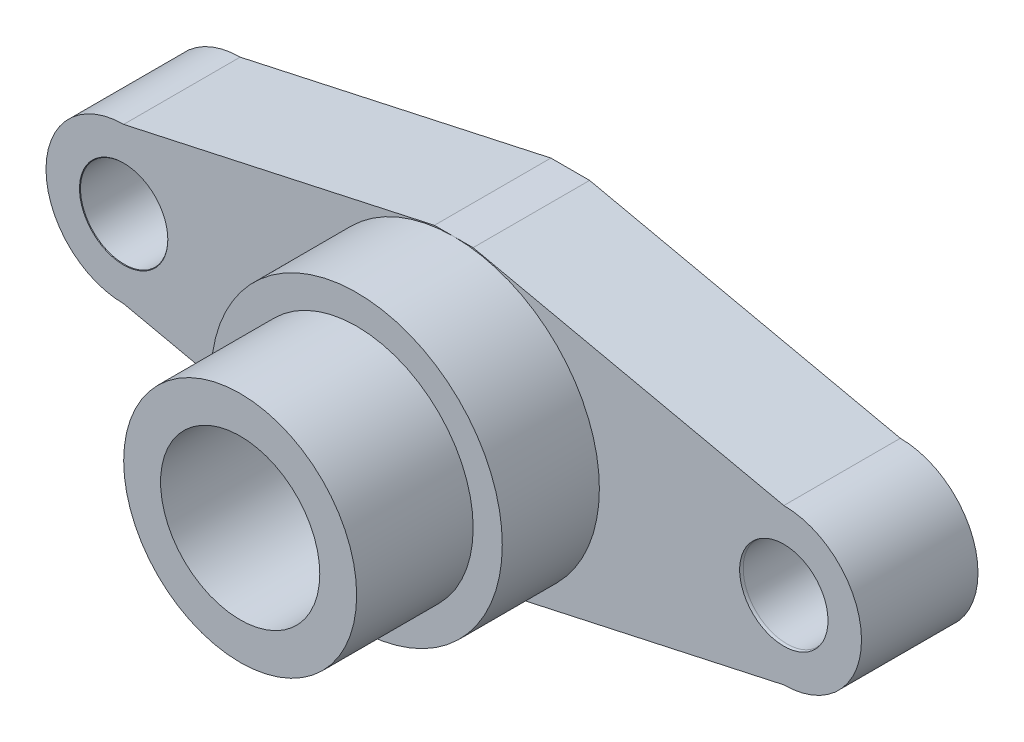
ISO-10303-21;
HEADER;
FILE_DESCRIPTION(('STEP AP214'),'2;1');
FILE_NAME('part.step','',(''),(''),'','','');
FILE_SCHEMA(('AUTOMOTIVE_DESIGN { 1 0 10303 214 1 1 1 1 }'));
ENDSEC;
DATA;
#1=APPLICATION_CONTEXT('core data for automotive mechanical design processes');
#2=APPLICATION_PROTOCOL_DEFINITION('international standard','automotive_design',2000,#1);
#3=PRODUCT_CONTEXT('',#1,'mechanical');
#4=PRODUCT('Part','Part','',(#3));
#5=PRODUCT_RELATED_PRODUCT_CATEGORY('part','',(#4));
#6=PRODUCT_DEFINITION_FORMATION('','',#4);
#7=PRODUCT_DEFINITION_CONTEXT('part definition',#1,'design');
#8=PRODUCT_DEFINITION('design','',#6,#7);
#9=PRODUCT_DEFINITION_SHAPE('','',#8);
#10=(LENGTH_UNIT() NAMED_UNIT(*) SI_UNIT(.MILLI.,.METRE.));
#11=(NAMED_UNIT(*) PLANE_ANGLE_UNIT() SI_UNIT($,.RADIAN.));
#12=(NAMED_UNIT(*) SI_UNIT($,.STERADIAN.) SOLID_ANGLE_UNIT());
#13=UNCERTAINTY_MEASURE_WITH_UNIT(LENGTH_MEASURE(1.E-05),#10,'distance_accuracy_value','');
#14=(GEOMETRIC_REPRESENTATION_CONTEXT(3) GLOBAL_UNCERTAINTY_ASSIGNED_CONTEXT((#13)) GLOBAL_UNIT_ASSIGNED_CONTEXT((#10,
#11,#12)) REPRESENTATION_CONTEXT('',''));
#15=CARTESIAN_POINT('',(0.,0.,0.));
#16=DIRECTION('',(0.,0.,1.));
#17=DIRECTION('',(1.,0.,0.));
#18=AXIS2_PLACEMENT_3D('',#15,#16,#17);
#19=CARTESIAN_POINT('',(17.,0.,6.));
#20=DIRECTION('',(0.,0.,1.));
#21=DIRECTION('',(1.,0.,0.));
#22=AXIS2_PLACEMENT_3D('',#19,#20,#21);
#23=PLANE('',#22);
#24=CARTESIAN_POINT('',(-17.,0.,6.));
#25=DIRECTION('',(0.,0.,1.));
#26=DIRECTION('',(1.,0.,0.));
#27=AXIS2_PLACEMENT_3D('',#24,#25,#26);
#28=CIRCLE('',#27,2.275);
#29=CARTESIAN_POINT('',(-14.725,0.,6.));
#30=VERTEX_POINT('',#29);
#31=EDGE_CURVE('E250',#30,#30,#28,.T.);
#32=ORIENTED_EDGE('',*,*,#31,.F.);
#33=EDGE_LOOP('',(#32));
#34=FACE_BOUND('',#33,.T.);
#35=CARTESIAN_POINT('',(0.,0.,6.));
#36=DIRECTION('',(0.,0.,1.));
#37=DIRECTION('',(1.,0.,0.));
#38=AXIS2_PLACEMENT_3D('',#35,#36,#37);
#39=CIRCLE('',#38,7.5);
#40=CARTESIAN_POINT('',(0.,7.5,6.));
#41=VERTEX_POINT('',#40);
#42=CARTESIAN_POINT('',(0.,-7.5,6.));
#43=VERTEX_POINT('',#42);
#44=EDGE_CURVE('E160',#41,#43,#39,.T.);
#45=ORIENTED_EDGE('',*,*,#44,.F.);
#46=DIRECTION('',(-1.,0.,0.));
#47=VECTOR('',#46,1.);
#48=CARTESIAN_POINT('',(-0.9965652031175,7.5,6.));
#49=LINE('',#48,#47);
#50=CARTESIAN_POINT('',(-0.9965652031175,7.5,6.));
#51=VERTEX_POINT('',#50);
#52=EDGE_CURVE('E130',#41,#51,#49,.T.);
#53=ORIENTED_EDGE('',*,*,#52,.T.);
#54=DIRECTION('',(-0.976909591411327,-0.213653107182072,0.));
#55=VECTOR('',#54,1.);
#56=CARTESIAN_POINT('',(-17.,4.,6.));
#57=LINE('',#56,#55);
#58=CARTESIAN_POINT('',(-17.,4.,6.));
#59=VERTEX_POINT('',#58);
#60=EDGE_CURVE('E123',#51,#59,#57,.T.);
#61=ORIENTED_EDGE('',*,*,#60,.T.);
#62=CARTESIAN_POINT('',(-17.,0.,6.));
#63=DIRECTION('',(0.,0.,1.));
#64=DIRECTION('',(-1.,0.,0.));
#65=AXIS2_PLACEMENT_3D('',#62,#63,#64);
#66=CIRCLE('',#65,4.);
#67=CARTESIAN_POINT('',(-17.,-4.,6.));
#68=VERTEX_POINT('',#67);
#69=EDGE_CURVE('E127',#59,#68,#66,.T.);
#70=ORIENTED_EDGE('',*,*,#69,.T.);
#71=DIRECTION('',(0.976909591411327,-0.213653107182072,0.));
#72=VECTOR('',#71,1.);
#73=CARTESIAN_POINT('',(-17.,-4.,6.));
#74=LINE('',#73,#72);
#75=CARTESIAN_POINT('',(-0.9965652031175,-7.5,6.));
#76=VERTEX_POINT('',#75);
#77=EDGE_CURVE('E70',#68,#76,#74,.T.);
#78=ORIENTED_EDGE('',*,*,#77,.T.);
#79=DIRECTION('',(1.,0.,0.));
#80=VECTOR('',#79,1.);
#81=CARTESIAN_POINT('',(-0.9965652031175,-7.5,6.));
#82=LINE('',#81,#80);
#83=EDGE_CURVE('E216',#76,#43,#82,.T.);
#84=ORIENTED_EDGE('',*,*,#83,.T.);
#85=EDGE_LOOP('',(#45,#53,#61,#70,#78,#84));
#86=FACE_BOUND('',#85,.T.);
#87=ADVANCED_FACE('F45',(#34,#86),#23,.T.);
#88=CARTESIAN_POINT('',(-0.9965652031175,-7.5,6.));
#89=DIRECTION('',(0.,1.,0.));
#90=DIRECTION('',(0.,0.,1.));
#91=AXIS2_PLACEMENT_3D('',#88,#89,#90);
#92=PLANE('',#91);
#93=DIRECTION('',(1.,0.,0.));
#94=VECTOR('',#93,1.);
#95=CARTESIAN_POINT('',(-0.9965652031175,-7.5,0.));
#96=LINE('',#95,#94);
#97=CARTESIAN_POINT('',(-0.9965652031175,-7.5,0.));
#98=VERTEX_POINT('',#97);
#99=CARTESIAN_POINT('',(0.9965652031175,-7.5,0.));
#100=VERTEX_POINT('',#99);
#101=EDGE_CURVE('E156',#98,#100,#96,.T.);
#102=ORIENTED_EDGE('',*,*,#101,.T.);
#103=DIRECTION('',(0.,0.,-1.));
#104=VECTOR('',#103,1.);
#105=CARTESIAN_POINT('',(0.9965652031175,-7.5,6.));
#106=LINE('',#105,#104);
#107=CARTESIAN_POINT('',(0.9965652031175,-7.5,6.));
#108=VERTEX_POINT('',#107);
#109=EDGE_CURVE('E196',#108,#100,#106,.T.);
#110=ORIENTED_EDGE('',*,*,#109,.F.);
#111=EDGE_CURVE('E108',#43,#108,#82,.T.);
#112=ORIENTED_EDGE('',*,*,#111,.F.);
#113=ORIENTED_EDGE('',*,*,#83,.F.);
#114=DIRECTION('',(0.,0.,-1.));
#115=VECTOR('',#114,1.);
#116=CARTESIAN_POINT('',(-0.9965652031175,-7.5,6.));
#117=LINE('',#116,#115);
#118=EDGE_CURVE('E152',#76,#98,#117,.T.);
#119=ORIENTED_EDGE('',*,*,#118,.T.);
#120=EDGE_LOOP('',(#102,#110,#112,#113,#119));
#121=FACE_BOUND('',#120,.T.);
#122=ADVANCED_FACE('F281',(#121),#92,.F.);
#123=CARTESIAN_POINT('',(17.,-4.,6.));
#124=DIRECTION('',(-0.213653107182072,0.976909591411327,0.));
#125=DIRECTION('',(-0.976909591411327,-0.213653107182072,0.));
#126=AXIS2_PLACEMENT_3D('',#123,#124,#125);
#127=PLANE('',#126);
#128=DIRECTION('',(0.976909591411327,0.213653107182072,0.));
#129=VECTOR('',#128,1.);
#130=CARTESIAN_POINT('',(17.,-4.,0.));
#131=LINE('',#130,#129);
#132=CARTESIAN_POINT('',(17.,-4.,0.));
#133=VERTEX_POINT('',#132);
#134=EDGE_CURVE('E159',#100,#133,#131,.T.);
#135=ORIENTED_EDGE('',*,*,#134,.T.);
#136=DIRECTION('',(0.,0.,-1.));
#137=VECTOR('',#136,1.);
#138=CARTESIAN_POINT('',(17.,-4.,6.));
#139=LINE('',#138,#137);
#140=CARTESIAN_POINT('',(17.,-4.,6.));
#141=VERTEX_POINT('',#140);
#142=EDGE_CURVE('E193',#141,#133,#139,.T.);
#143=ORIENTED_EDGE('',*,*,#142,.F.);
#144=DIRECTION('',(0.976909591411327,0.213653107182072,0.));
#145=VECTOR('',#144,1.);
#146=CARTESIAN_POINT('',(17.,-4.,6.));
#147=LINE('',#146,#145);
#148=EDGE_CURVE('E219',#108,#141,#147,.T.);
#149=ORIENTED_EDGE('',*,*,#148,.F.);
#150=ORIENTED_EDGE('',*,*,#109,.T.);
#151=EDGE_LOOP('',(#135,#143,#149,#150));
#152=FACE_BOUND('',#151,.T.);
#153=ADVANCED_FACE('F286',(#152),#127,.F.);
#154=CARTESIAN_POINT('',(17.,0.,6.));
#155=DIRECTION('',(0.,0.,-1.));
#156=DIRECTION('',(-1.,0.,0.));
#157=AXIS2_PLACEMENT_3D('',#154,#155,#156);
#158=CYLINDRICAL_SURFACE('',#157,4.);
#159=CARTESIAN_POINT('',(17.,0.,0.));
#160=DIRECTION('',(0.,0.,1.));
#161=DIRECTION('',(1.,0.,0.));
#162=AXIS2_PLACEMENT_3D('',#159,#160,#161);
#163=CIRCLE('',#162,4.);
#164=CARTESIAN_POINT('',(17.,4.,0.));
#165=VERTEX_POINT('',#164);
#166=EDGE_CURVE('E163',#133,#165,#163,.T.);
#167=ORIENTED_EDGE('',*,*,#166,.T.);
#168=DIRECTION('',(0.,0.,-1.));
#169=VECTOR('',#168,1.);
#170=CARTESIAN_POINT('',(17.,4.,6.));
#171=LINE('',#170,#169);
#172=CARTESIAN_POINT('',(17.,4.,6.));
#173=VERTEX_POINT('',#172);
#174=EDGE_CURVE('E189',#173,#165,#171,.T.);
#175=ORIENTED_EDGE('',*,*,#174,.F.);
#176=CARTESIAN_POINT('',(17.,0.,6.));
#177=DIRECTION('',(0.,0.,1.));
#178=DIRECTION('',(1.,0.,0.));
#179=AXIS2_PLACEMENT_3D('',#176,#177,#178);
#180=CIRCLE('',#179,4.);
#181=EDGE_CURVE('E222',#141,#173,#180,.T.);
#182=ORIENTED_EDGE('',*,*,#181,.F.);
#183=ORIENTED_EDGE('',*,*,#142,.T.);
#184=EDGE_LOOP('',(#167,#175,#182,#183));
#185=FACE_BOUND('',#184,.T.);
#186=ADVANCED_FACE('F341',(#185),#158,.T.);
#187=CARTESIAN_POINT('',(17.,4.,6.));
#188=DIRECTION('',(-0.213653107182072,-0.976909591411327,0.));
#189=DIRECTION('',(0.976909591411327,-0.213653107182072,0.));
#190=AXIS2_PLACEMENT_3D('',#187,#188,#189);
#191=PLANE('',#190);
#192=DIRECTION('',(-0.976909591411327,0.213653107182072,0.));
#193=VECTOR('',#192,1.);
#194=CARTESIAN_POINT('',(17.,4.,0.));
#195=LINE('',#194,#193);
#196=CARTESIAN_POINT('',(0.9965652031175,7.5,0.));
#197=VERTEX_POINT('',#196);
#198=EDGE_CURVE('E166',#165,#197,#195,.T.);
#199=ORIENTED_EDGE('',*,*,#198,.T.);
#200=DIRECTION('',(0.,0.,-1.));
#201=VECTOR('',#200,1.);
#202=CARTESIAN_POINT('',(0.9965652031175,7.5,6.));
#203=LINE('',#202,#201);
#204=CARTESIAN_POINT('',(0.9965652031175,7.5,6.));
#205=VERTEX_POINT('',#204);
#206=EDGE_CURVE('E185',#205,#197,#203,.T.);
#207=ORIENTED_EDGE('',*,*,#206,.F.);
#208=DIRECTION('',(-0.976909591411327,0.213653107182072,0.));
#209=VECTOR('',#208,1.);
#210=CARTESIAN_POINT('',(17.,4.,6.));
#211=LINE('',#210,#209);
#212=EDGE_CURVE('E225',#173,#205,#211,.T.);
#213=ORIENTED_EDGE('',*,*,#212,.F.);
#214=ORIENTED_EDGE('',*,*,#174,.T.);
#215=EDGE_LOOP('',(#199,#207,#213,#214));
#216=FACE_BOUND('',#215,.T.);
#217=ADVANCED_FACE('F346',(#216),#191,.F.);
#218=CARTESIAN_POINT('',(-0.9965652031175,7.5,6.));
#219=DIRECTION('',(0.,-1.,0.));
#220=DIRECTION('',(0.,0.,-1.));
#221=AXIS2_PLACEMENT_3D('',#218,#219,#220);
#222=PLANE('',#221);
#223=DIRECTION('',(-1.,0.,0.));
#224=VECTOR('',#223,1.);
#225=CARTESIAN_POINT('',(-0.9965652031175,7.5,0.));
#226=LINE('',#225,#224);
#227=CARTESIAN_POINT('',(-0.9965652031175,7.5,0.));
#228=VERTEX_POINT('',#227);
#229=EDGE_CURVE('E169',#197,#228,#226,.T.);
#230=ORIENTED_EDGE('',*,*,#229,.T.);
#231=DIRECTION('',(0.,0.,-1.));
#232=VECTOR('',#231,1.);
#233=CARTESIAN_POINT('',(-0.9965652031175,7.5,6.));
#234=LINE('',#233,#232);
#235=EDGE_CURVE('E145',#51,#228,#234,.T.);
#236=ORIENTED_EDGE('',*,*,#235,.F.);
#237=ORIENTED_EDGE('',*,*,#52,.F.);
#238=EDGE_CURVE('E135',#205,#41,#49,.T.);
#239=ORIENTED_EDGE('',*,*,#238,.F.);
#240=ORIENTED_EDGE('',*,*,#206,.T.);
#241=EDGE_LOOP('',(#230,#236,#237,#239,#240));
#242=FACE_BOUND('',#241,.T.);
#243=ADVANCED_FACE('F349',(#242),#222,.F.);
#244=CARTESIAN_POINT('',(-17.,4.,6.));
#245=DIRECTION('',(0.213653107182072,-0.976909591411327,0.));
#246=DIRECTION('',(0.976909591411327,0.213653107182072,0.));
#247=AXIS2_PLACEMENT_3D('',#244,#245,#246);
#248=PLANE('',#247);
#249=DIRECTION('',(-0.976909591411327,-0.213653107182072,0.));
#250=VECTOR('',#249,1.);
#251=CARTESIAN_POINT('',(-17.,4.,0.));
#252=LINE('',#251,#250);
#253=CARTESIAN_POINT('',(-17.,4.,0.));
#254=VERTEX_POINT('',#253);
#255=EDGE_CURVE('E141',#228,#254,#252,.T.);
#256=ORIENTED_EDGE('',*,*,#255,.T.);
#257=DIRECTION('',(0.,0.,-1.));
#258=VECTOR('',#257,1.);
#259=CARTESIAN_POINT('',(-17.,4.,6.));
#260=LINE('',#259,#258);
#261=EDGE_CURVE('E138',#59,#254,#260,.T.);
#262=ORIENTED_EDGE('',*,*,#261,.F.);
#263=ORIENTED_EDGE('',*,*,#60,.F.);
#264=ORIENTED_EDGE('',*,*,#235,.T.);
#265=EDGE_LOOP('',(#256,#262,#263,#264));
#266=FACE_BOUND('',#265,.T.);
#267=ADVANCED_FACE('F139',(#266),#248,.F.);
#268=CARTESIAN_POINT('',(-17.,0.,6.));
#269=DIRECTION('',(0.,0.,-1.));
#270=DIRECTION('',(-1.,0.,0.));
#271=AXIS2_PLACEMENT_3D('',#268,#269,#270);
#272=CYLINDRICAL_SURFACE('',#271,4.);
#273=CARTESIAN_POINT('',(-17.,0.,0.));
#274=DIRECTION('',(0.,0.,1.));
#275=DIRECTION('',(-1.,0.,0.));
#276=AXIS2_PLACEMENT_3D('',#273,#274,#275);
#277=CIRCLE('',#276,4.);
#278=CARTESIAN_POINT('',(-17.,-4.,0.));
#279=VERTEX_POINT('',#278);
#280=EDGE_CURVE('E174',#254,#279,#277,.T.);
#281=ORIENTED_EDGE('',*,*,#280,.T.);
#282=DIRECTION('',(0.,0.,-1.));
#283=VECTOR('',#282,1.);
#284=CARTESIAN_POINT('',(-17.,-4.,6.));
#285=LINE('',#284,#283);
#286=EDGE_CURVE('E146',#68,#279,#285,.T.);
#287=ORIENTED_EDGE('',*,*,#286,.F.);
#288=ORIENTED_EDGE('',*,*,#69,.F.);
#289=ORIENTED_EDGE('',*,*,#261,.T.);
#290=EDGE_LOOP('',(#281,#287,#288,#289));
#291=FACE_BOUND('',#290,.T.);
#292=ADVANCED_FACE('F148',(#291),#272,.T.);
#293=CARTESIAN_POINT('',(-17.,-4.,6.));
#294=DIRECTION('',(0.213653107182072,0.976909591411327,0.));
#295=DIRECTION('',(-0.976909591411327,0.213653107182072,0.));
#296=AXIS2_PLACEMENT_3D('',#293,#294,#295);
#297=PLANE('',#296);
#298=DIRECTION('',(0.976909591411327,-0.213653107182072,0.));
#299=VECTOR('',#298,1.);
#300=CARTESIAN_POINT('',(-17.,-4.,0.));
#301=LINE('',#300,#299);
#302=EDGE_CURVE('E103',#279,#98,#301,.T.);
#303=ORIENTED_EDGE('',*,*,#302,.T.);
#304=ORIENTED_EDGE('',*,*,#118,.F.);
#305=ORIENTED_EDGE('',*,*,#77,.F.);
#306=ORIENTED_EDGE('',*,*,#286,.T.);
#307=EDGE_LOOP('',(#303,#304,#305,#306));
#308=FACE_BOUND('',#307,.T.);
#309=ADVANCED_FACE('F269',(#308),#297,.F.);
#310=CARTESIAN_POINT('',(17.,0.,6.));
#311=DIRECTION('',(0.,0.,1.));
#312=DIRECTION('',(1.,0.,0.));
#313=AXIS2_PLACEMENT_3D('',#310,#311,#312);
#314=CIRCLE('',#313,2.275);
#315=CARTESIAN_POINT('',(19.275,0.,6.));
#316=VERTEX_POINT('',#315);
#317=EDGE_CURVE('E258',#316,#316,#314,.T.);
#318=ORIENTED_EDGE('',*,*,#317,.F.);
#319=EDGE_LOOP('',(#318));
#320=FACE_BOUND('',#319,.T.);
#321=EDGE_CURVE('E61',#43,#41,#39,.T.);
#322=ORIENTED_EDGE('',*,*,#321,.F.);
#323=ORIENTED_EDGE('',*,*,#111,.T.);
#324=ORIENTED_EDGE('',*,*,#148,.T.);
#325=ORIENTED_EDGE('',*,*,#181,.T.);
#326=ORIENTED_EDGE('',*,*,#212,.T.);
#327=ORIENTED_EDGE('',*,*,#238,.T.);
#328=EDGE_LOOP('',(#322,#323,#324,#325,#326,#327));
#329=FACE_BOUND('',#328,.T.);
#330=ADVANCED_FACE('F266',(#320,#329),#23,.T.);
#331=CARTESIAN_POINT('',(17.,0.,0.));
#332=DIRECTION('',(0.,0.,1.));
#333=DIRECTION('',(1.,0.,0.));
#334=AXIS2_PLACEMENT_3D('',#331,#332,#333);
#335=PLANE('',#334);
#336=CARTESIAN_POINT('',(17.,0.,0.));
#337=DIRECTION('',(0.,0.,1.));
#338=DIRECTION('',(1.,0.,0.));
#339=AXIS2_PLACEMENT_3D('',#336,#337,#338);
#340=CIRCLE('',#339,2.25);
#341=CARTESIAN_POINT('',(19.25,0.,0.));
#342=VERTEX_POINT('',#341);
#343=EDGE_CURVE('E254',#342,#342,#340,.T.);
#344=ORIENTED_EDGE('',*,*,#343,.T.);
#345=EDGE_LOOP('',(#344));
#346=FACE_BOUND('',#345,.T.);
#347=CARTESIAN_POINT('',(-17.,0.,0.));
#348=DIRECTION('',(0.,0.,1.));
#349=DIRECTION('',(1.,0.,0.));
#350=AXIS2_PLACEMENT_3D('',#347,#348,#349);
#351=CIRCLE('',#350,2.25);
#352=CARTESIAN_POINT('',(-14.75,0.,0.));
#353=VERTEX_POINT('',#352);
#354=EDGE_CURVE('E242',#353,#353,#351,.T.);
#355=ORIENTED_EDGE('',*,*,#354,.T.);
#356=EDGE_LOOP('',(#355));
#357=FACE_BOUND('',#356,.T.);
#358=ORIENTED_EDGE('',*,*,#134,.F.);
#359=ORIENTED_EDGE('',*,*,#101,.F.);
#360=ORIENTED_EDGE('',*,*,#302,.F.);
#361=ORIENTED_EDGE('',*,*,#280,.F.);
#362=ORIENTED_EDGE('',*,*,#255,.F.);
#363=ORIENTED_EDGE('',*,*,#229,.F.);
#364=ORIENTED_EDGE('',*,*,#198,.F.);
#365=ORIENTED_EDGE('',*,*,#166,.F.);
#366=EDGE_LOOP('',(#358,#359,#360,#361,#362,#363,#364,#365));
#367=FACE_BOUND('',#366,.T.);
#368=ADVANCED_FACE('F268',(#346,#357,#367),#335,.F.);
#369=CARTESIAN_POINT('',(0.,0.,-21.2132034355964));
#370=DIRECTION('',(0.,0.,1.));
#371=DIRECTION('',(1.,0.,0.));
#372=AXIS2_PLACEMENT_3D('',#369,#370,#371);
#373=CYLINDRICAL_SURFACE('',#372,7.5);
#374=ORIENTED_EDGE('',*,*,#321,.T.);
#375=ORIENTED_EDGE('',*,*,#44,.T.);
#376=EDGE_LOOP('',(#374,#375));
#377=FACE_BOUND('',#376,.T.);
#378=CARTESIAN_POINT('',(0.,0.,11.));
#379=DIRECTION('',(0.,0.,1.));
#380=DIRECTION('',(1.,0.,0.));
#381=AXIS2_PLACEMENT_3D('',#378,#379,#380);
#382=CIRCLE('',#381,7.5);
#383=CARTESIAN_POINT('',(7.5,0.,11.));
#384=VERTEX_POINT('',#383);
#385=EDGE_CURVE('E210',#384,#384,#382,.T.);
#386=ORIENTED_EDGE('',*,*,#385,.F.);
#387=EDGE_LOOP('',(#386));
#388=FACE_BOUND('',#387,.T.);
#389=ADVANCED_FACE('F275',(#377,#388),#373,.T.);
#390=CARTESIAN_POINT('',(0.,0.,11.));
#391=DIRECTION('',(0.,0.,1.));
#392=DIRECTION('',(1.,0.,0.));
#393=AXIS2_PLACEMENT_3D('',#390,#391,#392);
#394=PLANE('',#393);
#395=CARTESIAN_POINT('',(0.,0.,11.));
#396=DIRECTION('',(0.,0.,1.));
#397=DIRECTION('',(1.,0.,0.));
#398=AXIS2_PLACEMENT_3D('',#395,#396,#397);
#399=CIRCLE('',#398,6.);
#400=CARTESIAN_POINT('',(6.,0.,11.));
#401=VERTEX_POINT('',#400);
#402=EDGE_CURVE('E54',#401,#401,#399,.T.);
#403=ORIENTED_EDGE('',*,*,#402,.F.);
#404=EDGE_LOOP('',(#403));
#405=FACE_BOUND('',#404,.T.);
#406=ORIENTED_EDGE('',*,*,#385,.T.);
#407=EDGE_LOOP('',(#406));
#408=FACE_BOUND('',#407,.T.);
#409=ADVANCED_FACE('F321',(#405,#408),#394,.T.);
#410=CARTESIAN_POINT('',(0.,0.,17.));
#411=DIRECTION('',(0.,0.,-1.));
#412=DIRECTION('',(-1.,0.,0.));
#413=AXIS2_PLACEMENT_3D('',#410,#411,#412);
#414=CYLINDRICAL_SURFACE('',#413,6.);
#415=CARTESIAN_POINT('',(0.,0.,17.));
#416=DIRECTION('',(0.,0.,1.));
#417=DIRECTION('',(1.,0.,0.));
#418=AXIS2_PLACEMENT_3D('',#415,#416,#417);
#419=CIRCLE('',#418,6.);
#420=CARTESIAN_POINT('',(6.,0.,17.));
#421=VERTEX_POINT('',#420);
#422=EDGE_CURVE('E208',#421,#421,#419,.T.);
#423=ORIENTED_EDGE('',*,*,#422,.F.);
#424=EDGE_LOOP('',(#423));
#425=FACE_BOUND('',#424,.T.);
#426=ORIENTED_EDGE('',*,*,#402,.T.);
#427=EDGE_LOOP('',(#426));
#428=FACE_BOUND('',#427,.T.);
#429=ADVANCED_FACE('F317',(#425,#428),#414,.T.);
#430=CARTESIAN_POINT('',(0.,0.,17.));
#431=DIRECTION('',(0.,0.,1.));
#432=DIRECTION('',(1.,0.,0.));
#433=AXIS2_PLACEMENT_3D('',#430,#431,#432);
#434=PLANE('',#433);
#435=CARTESIAN_POINT('',(0.,0.,17.));
#436=DIRECTION('',(0.,0.,1.));
#437=DIRECTION('',(1.,0.,0.));
#438=AXIS2_PLACEMENT_3D('',#435,#436,#437);
#439=CIRCLE('',#438,4.1);
#440=CARTESIAN_POINT('',(4.1,0.,17.));
#441=VERTEX_POINT('',#440);
#442=EDGE_CURVE('E239',#441,#441,#439,.T.);
#443=ORIENTED_EDGE('',*,*,#442,.F.);
#444=EDGE_LOOP('',(#443));
#445=FACE_BOUND('',#444,.T.);
#446=ORIENTED_EDGE('',*,*,#422,.T.);
#447=EDGE_LOOP('',(#446));
#448=FACE_BOUND('',#447,.T.);
#449=ADVANCED_FACE('F313',(#445,#448),#434,.T.);
#450=CARTESIAN_POINT('',(0.,0.,-11.5965512114594));
#451=DIRECTION('',(0.,0.,1.));
#452=DIRECTION('',(1.,0.,0.));
#453=AXIS2_PLACEMENT_3D('',#450,#451,#452);
#454=CYLINDRICAL_SURFACE('',#453,4.1);
#455=CARTESIAN_POINT('',(0.,0.,3.));
#456=DIRECTION('',(0.,0.,1.));
#457=DIRECTION('',(1.,0.,0.));
#458=AXIS2_PLACEMENT_3D('',#455,#456,#457);
#459=CIRCLE('',#458,4.1);
#460=CARTESIAN_POINT('',(4.1,0.,3.));
#461=VERTEX_POINT('',#460);
#462=EDGE_CURVE('E236',#461,#461,#459,.F.);
#463=ORIENTED_EDGE('',*,*,#462,.T.);
#464=EDGE_LOOP('',(#463));
#465=FACE_BOUND('',#464,.T.);
#466=ORIENTED_EDGE('',*,*,#442,.T.);
#467=EDGE_LOOP('',(#466));
#468=FACE_BOUND('',#467,.T.);
#469=ADVANCED_FACE('F309',(#465,#468),#454,.F.);
#470=CARTESIAN_POINT('',(17.,0.,3.));
#471=DIRECTION('',(0.,0.,1.));
#472=DIRECTION('',(1.,0.,0.));
#473=AXIS2_PLACEMENT_3D('',#470,#471,#472);
#474=PLANE('',#473);
#475=ORIENTED_EDGE('',*,*,#462,.F.);
#476=EDGE_LOOP('',(#475));
#477=FACE_BOUND('',#476,.T.);
#478=ADVANCED_FACE('F302',(#477),#474,.T.);
#479=CARTESIAN_POINT('',(-17.,0.,6.));
#480=DIRECTION('',(0.,0.,1.));
#481=DIRECTION('',(1.,0.,0.));
#482=AXIS2_PLACEMENT_3D('',#479,#480,#481);
#483=CYLINDRICAL_SURFACE('',#482,2.25);
#484=ORIENTED_EDGE('',*,*,#354,.F.);
#485=EDGE_LOOP('',(#484));
#486=FACE_BOUND('',#485,.T.);
#487=CARTESIAN_POINT('',(-17.,0.,5.975));
#488=DIRECTION('',(0.,0.,1.));
#489=DIRECTION('',(1.,0.,0.));
#490=AXIS2_PLACEMENT_3D('',#487,#488,#489);
#491=CIRCLE('',#490,2.25);
#492=CARTESIAN_POINT('',(-14.75,0.,5.975));
#493=VERTEX_POINT('',#492);
#494=EDGE_CURVE('E246',#493,#493,#491,.T.);
#495=ORIENTED_EDGE('',*,*,#494,.T.);
#496=EDGE_LOOP('',(#495));
#497=FACE_BOUND('',#496,.T.);
#498=ADVANCED_FACE('F293',(#486,#497),#483,.F.);
#499=CARTESIAN_POINT('',(-17.,0.,6.));
#500=DIRECTION('',(0.,0.,1.));
#501=DIRECTION('',(1.,0.,0.));
#502=AXIS2_PLACEMENT_3D('',#499,#500,#501);
#503=CONICAL_SURFACE('',#502,2.275,0.785398163397396);
#504=ORIENTED_EDGE('',*,*,#494,.F.);
#505=EDGE_LOOP('',(#504));
#506=FACE_BOUND('',#505,.T.);
#507=ORIENTED_EDGE('',*,*,#31,.T.);
#508=EDGE_LOOP('',(#507));
#509=FACE_BOUND('',#508,.T.);
#510=ADVANCED_FACE('F290',(#506,#509),#503,.F.);
#511=CARTESIAN_POINT('',(17.,0.,6.));
#512=DIRECTION('',(0.,0.,1.));
#513=DIRECTION('',(1.,0.,0.));
#514=AXIS2_PLACEMENT_3D('',#511,#512,#513);
#515=CYLINDRICAL_SURFACE('',#514,2.25);
#516=CARTESIAN_POINT('',(17.,0.,5.84387505004004));
#517=DIRECTION('',(0.,0.,1.));
#518=DIRECTION('',(1.,0.,0.));
#519=AXIS2_PLACEMENT_3D('',#516,#517,#518);
#520=CIRCLE('',#519,2.25);
#521=CARTESIAN_POINT('',(19.25,0.,5.84387505004004));
#522=VERTEX_POINT('',#521);
#523=EDGE_CURVE('E12',#522,#522,#520,.T.);
#524=ORIENTED_EDGE('',*,*,#523,.T.);
#525=EDGE_LOOP('',(#524));
#526=FACE_BOUND('',#525,.T.);
#527=ORIENTED_EDGE('',*,*,#343,.F.);
#528=EDGE_LOOP('',(#527));
#529=FACE_BOUND('',#528,.T.);
#530=ADVANCED_FACE('F292',(#526,#529),#515,.F.);
#531=CARTESIAN_POINT('',(17.,0.,5.84387505004004));
#532=DIRECTION('',(0.,0.,1.));
#533=DIRECTION('',(1.,0.,0.));
#534=AXIS2_PLACEMENT_3D('',#531,#532,#533);
#535=TOROIDAL_SURFACE('',#534,2.75,0.5);
#536=ORIENTED_EDGE('',*,*,#317,.T.);
#537=EDGE_LOOP('',(#536));
#538=FACE_BOUND('',#537,.T.);
#539=ORIENTED_EDGE('',*,*,#523,.F.);
#540=EDGE_LOOP('',(#539));
#541=FACE_BOUND('',#540,.T.);
#542=ADVANCED_FACE('F47',(#538,#541),#535,.T.);
#543=CLOSED_SHELL('',(#87,#122,#153,#186,#217,#243,#267,#292,#309,#330,#368,#389,#409,#429,#449,
#469,#478,#498,#510,#530,#542));
#544=MANIFOLD_SOLID_BREP('B2',#543);
#545=ADVANCED_BREP_SHAPE_REPRESENTATION('',(#18,#544),#14);
#546=SHAPE_DEFINITION_REPRESENTATION(#9,#545);
ENDSEC;
END-ISO-10303-21;
